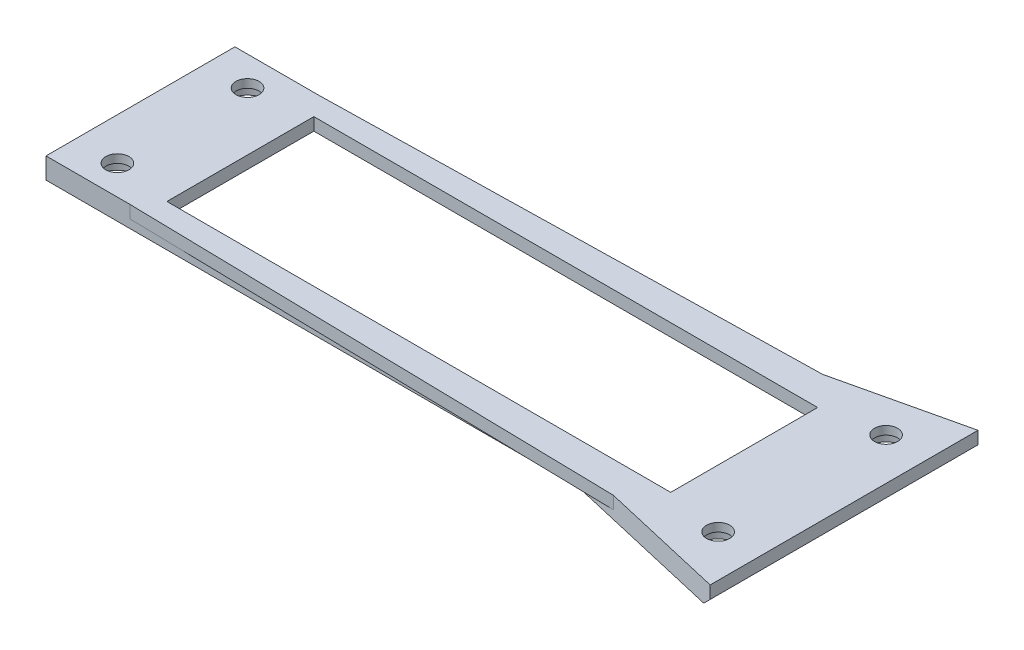
ISO-10303-21;
HEADER;
FILE_DESCRIPTION(('STEP AP214'),'2;1');
FILE_NAME('part.step','',(''),(''),'','','');
FILE_SCHEMA(('AUTOMOTIVE_DESIGN { 1 0 10303 214 1 1 1 1 }'));
ENDSEC;
DATA;
#1=APPLICATION_CONTEXT('core data for automotive mechanical design processes');
#2=APPLICATION_PROTOCOL_DEFINITION('international standard','automotive_design',2000,#1);
#3=PRODUCT_CONTEXT('',#1,'mechanical');
#4=PRODUCT('Part','Part','',(#3));
#5=PRODUCT_RELATED_PRODUCT_CATEGORY('part','',(#4));
#6=PRODUCT_DEFINITION_FORMATION('','',#4);
#7=PRODUCT_DEFINITION_CONTEXT('part definition',#1,'design');
#8=PRODUCT_DEFINITION('design','',#6,#7);
#9=PRODUCT_DEFINITION_SHAPE('','',#8);
#10=(LENGTH_UNIT() NAMED_UNIT(*) SI_UNIT(.MILLI.,.METRE.));
#11=(NAMED_UNIT(*) PLANE_ANGLE_UNIT() SI_UNIT($,.RADIAN.));
#12=(NAMED_UNIT(*) SI_UNIT($,.STERADIAN.) SOLID_ANGLE_UNIT());
#13=UNCERTAINTY_MEASURE_WITH_UNIT(LENGTH_MEASURE(1.E-05),#10,'distance_accuracy_value','');
#14=(GEOMETRIC_REPRESENTATION_CONTEXT(3) GLOBAL_UNCERTAINTY_ASSIGNED_CONTEXT((#13)) GLOBAL_UNIT_ASSIGNED_CONTEXT((#10,
#11,#12)) REPRESENTATION_CONTEXT('',''));
#15=CARTESIAN_POINT('',(0.,0.,0.));
#16=DIRECTION('',(0.,0.,1.));
#17=DIRECTION('',(1.,0.,0.));
#18=AXIS2_PLACEMENT_3D('',#15,#16,#17);
#19=CARTESIAN_POINT('',(83.8,5.,35.6771224045943));
#20=DIRECTION('',(-1.,0.,0.));
#21=DIRECTION('',(0.,0.,1.));
#22=AXIS2_PLACEMENT_3D('',#19,#20,#21);
#23=PLANE('',#22);
#24=DIRECTION('',(0.,-1.,0.));
#25=VECTOR('',#24,1.);
#26=CARTESIAN_POINT('',(83.8,5.,31.8961102765045));
#27=LINE('',#26,#25);
#28=CARTESIAN_POINT('',(83.8,5.,31.8961102765045));
#29=VERTEX_POINT('',#28);
#30=CARTESIAN_POINT('',(83.8,2.,31.8961102765045));
#31=VERTEX_POINT('',#30);
#32=EDGE_CURVE('E224',#29,#31,#27,.T.);
#33=ORIENTED_EDGE('',*,*,#32,.T.);
#34=DIRECTION('',(0.,0.,-1.));
#35=VECTOR('',#34,1.);
#36=CARTESIAN_POINT('',(83.8,2.,35.6771224045943));
#37=LINE('',#36,#35);
#38=CARTESIAN_POINT('',(83.8,2.,-31.8961102765217));
#39=VERTEX_POINT('',#38);
#40=EDGE_CURVE('E258',#31,#39,#37,.T.);
#41=ORIENTED_EDGE('',*,*,#40,.T.);
#42=DIRECTION('',(0.,1.,0.));
#43=VECTOR('',#42,1.);
#44=CARTESIAN_POINT('',(83.8,5.,-31.8961102765217));
#45=LINE('',#44,#43);
#46=CARTESIAN_POINT('',(83.8,5.,-31.8961102765217));
#47=VERTEX_POINT('',#46);
#48=EDGE_CURVE('E219',#39,#47,#45,.T.);
#49=ORIENTED_EDGE('',*,*,#48,.T.);
#50=DIRECTION('',(0.,0.,-1.));
#51=VECTOR('',#50,1.);
#52=CARTESIAN_POINT('',(83.8,5.,35.6771224045943));
#53=LINE('',#52,#51);
#54=EDGE_CURVE('E246',#29,#47,#53,.T.);
#55=ORIENTED_EDGE('',*,*,#54,.F.);
#56=EDGE_LOOP('',(#33,#41,#49,#55));
#57=FACE_BOUND('',#56,.T.);
#58=ADVANCED_FACE('F37',(#57),#23,.F.);
#59=CARTESIAN_POINT('',(-83.8,5.,-35.6771224045943));
#60=DIRECTION('',(1.,0.,0.));
#61=DIRECTION('',(0.,0.,-1.));
#62=AXIS2_PLACEMENT_3D('',#59,#60,#61);
#63=PLANE('',#62);
#64=DIRECTION('',(0.,0.,1.));
#65=VECTOR('',#64,1.);
#66=CARTESIAN_POINT('',(-83.8,0.,-35.6771224045943));
#67=LINE('',#66,#65);
#68=CARTESIAN_POINT('',(-83.8,0.,-22.5));
#69=VERTEX_POINT('',#68);
#70=CARTESIAN_POINT('',(-83.8,0.,22.5));
#71=VERTEX_POINT('',#70);
#72=EDGE_CURVE('E245',#69,#71,#67,.T.);
#73=ORIENTED_EDGE('',*,*,#72,.T.);
#74=DIRECTION('',(0.,1.,0.));
#75=VECTOR('',#74,1.);
#76=CARTESIAN_POINT('',(-83.8,5.,22.5));
#77=LINE('',#76,#75);
#78=CARTESIAN_POINT('',(-83.8,5.,22.5));
#79=VERTEX_POINT('',#78);
#80=EDGE_CURVE('E230',#71,#79,#77,.T.);
#81=ORIENTED_EDGE('',*,*,#80,.T.);
#82=DIRECTION('',(0.,0.,1.));
#83=VECTOR('',#82,1.);
#84=CARTESIAN_POINT('',(-83.8,5.,-35.6771224045943));
#85=LINE('',#84,#83);
#86=CARTESIAN_POINT('',(-83.8,5.,-22.5));
#87=VERTEX_POINT('',#86);
#88=EDGE_CURVE('E249',#87,#79,#85,.T.);
#89=ORIENTED_EDGE('',*,*,#88,.F.);
#90=DIRECTION('',(0.,-1.,0.));
#91=VECTOR('',#90,1.);
#92=CARTESIAN_POINT('',(-83.8,5.,-22.5));
#93=LINE('',#92,#91);
#94=EDGE_CURVE('E212',#87,#69,#93,.T.);
#95=ORIENTED_EDGE('',*,*,#94,.T.);
#96=EDGE_LOOP('',(#73,#81,#89,#95));
#97=FACE_BOUND('',#96,.T.);
#98=ADVANCED_FACE('F344',(#97),#63,.F.);
#99=CARTESIAN_POINT('',(0.,5.,0.));
#100=DIRECTION('',(0.,1.,0.));
#101=DIRECTION('',(0.,0.,1.));
#102=AXIS2_PLACEMENT_3D('',#99,#100,#101);
#103=PLANE('',#102);
#104=DIRECTION('',(0.,0.,-1.));
#105=VECTOR('',#104,1.);
#106=CARTESIAN_POINT('',(-60.,5.,17.5));
#107=LINE('',#106,#105);
#108=CARTESIAN_POINT('',(-60.,5.,17.5));
#109=VERTEX_POINT('',#108);
#110=CARTESIAN_POINT('',(-60.,5.,-17.5));
#111=VERTEX_POINT('',#110);
#112=EDGE_CURVE('E160',#109,#111,#107,.T.);
#113=ORIENTED_EDGE('',*,*,#112,.T.);
#114=DIRECTION('',(1.,0.,0.));
#115=VECTOR('',#114,1.);
#116=CARTESIAN_POINT('',(60.,5.,-17.5));
#117=LINE('',#116,#115);
#118=CARTESIAN_POINT('',(60.,5.,-17.5));
#119=VERTEX_POINT('',#118);
#120=EDGE_CURVE('E169',#111,#119,#117,.T.);
#121=ORIENTED_EDGE('',*,*,#120,.T.);
#122=DIRECTION('',(0.,0.,1.));
#123=VECTOR('',#122,1.);
#124=CARTESIAN_POINT('',(60.,5.,17.5));
#125=LINE('',#124,#123);
#126=CARTESIAN_POINT('',(60.,5.,17.5));
#127=VERTEX_POINT('',#126);
#128=EDGE_CURVE('E174',#119,#127,#125,.T.);
#129=ORIENTED_EDGE('',*,*,#128,.T.);
#130=DIRECTION('',(-1.,0.,0.));
#131=VECTOR('',#130,1.);
#132=CARTESIAN_POINT('',(60.,5.,17.5));
#133=LINE('',#132,#131);
#134=EDGE_CURVE('E165',#127,#109,#133,.T.);
#135=ORIENTED_EDGE('',*,*,#134,.T.);
#136=EDGE_LOOP('',(#113,#121,#129,#135));
#137=FACE_BOUND('',#136,.T.);
#138=DIRECTION('',(-1.,0.,0.));
#139=VECTOR('',#138,1.);
#140=CARTESIAN_POINT('',(0.,5.,22.5));
#141=LINE('',#140,#139);
#142=CARTESIAN_POINT('',(-63.8,5.,22.5));
#143=VERTEX_POINT('',#142);
#144=EDGE_CURVE('E228',#143,#79,#141,.T.);
#145=ORIENTED_EDGE('',*,*,#144,.F.);
#146=DIRECTION('',(-0.999786369275237,0.,-0.0206691995839033));
#147=VECTOR('',#146,1.);
#148=CARTESIAN_POINT('',(-63.8,5.,22.5));
#149=LINE('',#148,#147);
#150=CARTESIAN_POINT('',(53.7543735346199,5.,24.9302739897416));
#151=VERTEX_POINT('',#150);
#152=EDGE_CURVE('E227',#151,#143,#149,.T.);
#153=ORIENTED_EDGE('',*,*,#152,.F.);
#154=DIRECTION('',(-0.974161731885424,0.,-0.225851544448982));
#155=VECTOR('',#154,1.);
#156=CARTESIAN_POINT('',(-2.74310491286037,5.,11.8317890593797));
#157=LINE('',#156,#155);
#158=EDGE_CURVE('E221',#29,#151,#157,.T.);
#159=ORIENTED_EDGE('',*,*,#158,.F.);
#160=ORIENTED_EDGE('',*,*,#54,.T.);
#161=DIRECTION('',(0.974161731885424,0.,-0.225851544448982));
#162=VECTOR('',#161,1.);
#163=CARTESIAN_POINT('',(-2.74310491286413,5.,-11.8317890593959));
#164=LINE('',#163,#162);
#165=CARTESIAN_POINT('',(53.7543735346198,5.,-24.9302739897587));
#166=VERTEX_POINT('',#165);
#167=EDGE_CURVE('E216',#166,#47,#164,.T.);
#168=ORIENTED_EDGE('',*,*,#167,.F.);
#169=DIRECTION('',(0.999786369275234,0.,-0.0206691995840487));
#170=VECTOR('',#169,1.);
#171=CARTESIAN_POINT('',(53.7543735346197,5.,-24.9302739897587));
#172=LINE('',#171,#170);
#173=CARTESIAN_POINT('',(-63.7999999999988,5.,-22.5));
#174=VERTEX_POINT('',#173);
#175=EDGE_CURVE('E215',#174,#166,#172,.T.);
#176=ORIENTED_EDGE('',*,*,#175,.F.);
#177=DIRECTION('',(1.,0.,0.));
#178=VECTOR('',#177,1.);
#179=CARTESIAN_POINT('',(0.,5.,-22.5));
#180=LINE('',#179,#178);
#181=EDGE_CURVE('E203',#87,#174,#180,.T.);
#182=ORIENTED_EDGE('',*,*,#181,.F.);
#183=ORIENTED_EDGE('',*,*,#88,.T.);
#184=EDGE_LOOP('',(#145,#153,#159,#160,#168,#176,#182,#183));
#185=FACE_BOUND('',#184,.T.);
#186=CARTESIAN_POINT('',(-73.8,5.,-15.5));
#187=DIRECTION('',(0.,1.,0.));
#188=DIRECTION('',(0.,0.,1.));
#189=AXIS2_PLACEMENT_3D('',#186,#187,#188);
#190=CIRCLE('',#189,2.75000000000001);
#191=CARTESIAN_POINT('',(-73.8,5.,-12.75));
#192=VERTEX_POINT('',#191);
#193=EDGE_CURVE('E242',#192,#192,#190,.T.);
#194=ORIENTED_EDGE('',*,*,#193,.F.);
#195=EDGE_LOOP('',(#194));
#196=FACE_BOUND('',#195,.T.);
#197=CARTESIAN_POINT('',(73.7972396722643,5.,19.9999999999915));
#198=DIRECTION('',(0.,1.,0.));
#199=DIRECTION('',(0.,0.,1.));
#200=AXIS2_PLACEMENT_3D('',#197,#198,#199);
#201=CIRCLE('',#200,2.74999999999751);
#202=CARTESIAN_POINT('',(73.7972396722643,5.,22.749999999989));
#203=VERTEX_POINT('',#202);
#204=EDGE_CURVE('E239',#203,#203,#201,.T.);
#205=ORIENTED_EDGE('',*,*,#204,.F.);
#206=EDGE_LOOP('',(#205));
#207=FACE_BOUND('',#206,.T.);
#208=CARTESIAN_POINT('',(73.7972396722643,5.,-20.0000000000086));
#209=DIRECTION('',(0.,1.,0.));
#210=DIRECTION('',(0.,0.,1.));
#211=AXIS2_PLACEMENT_3D('',#208,#209,#210);
#212=CIRCLE('',#211,2.74999999999751);
#213=CARTESIAN_POINT('',(73.7972396722643,5.,-17.250000000011));
#214=VERTEX_POINT('',#213);
#215=EDGE_CURVE('E236',#214,#214,#212,.T.);
#216=ORIENTED_EDGE('',*,*,#215,.F.);
#217=EDGE_LOOP('',(#216));
#218=FACE_BOUND('',#217,.T.);
#219=CARTESIAN_POINT('',(-73.8,5.,15.5));
#220=DIRECTION('',(0.,1.,0.));
#221=DIRECTION('',(0.,0.,1.));
#222=AXIS2_PLACEMENT_3D('',#219,#220,#221);
#223=CIRCLE('',#222,2.75000000000001);
#224=CARTESIAN_POINT('',(-73.8,5.,18.25));
#225=VERTEX_POINT('',#224);
#226=EDGE_CURVE('E233',#225,#225,#223,.T.);
#227=ORIENTED_EDGE('',*,*,#226,.F.);
#228=EDGE_LOOP('',(#227));
#229=FACE_BOUND('',#228,.T.);
#230=ADVANCED_FACE('F176',(#137,#185,#196,#207,#218,#229),#103,.T.);
#231=CARTESIAN_POINT('',(0.,0.,0.));
#232=DIRECTION('',(0.,1.,0.));
#233=DIRECTION('',(0.,0.,1.));
#234=AXIS2_PLACEMENT_3D('',#231,#232,#233);
#235=PLANE('',#234);
#236=CARTESIAN_POINT('',(-73.8,0.,-15.5));
#237=DIRECTION('',(0.,-1.,0.));
#238=DIRECTION('',(0.,0.,-1.));
#239=AXIS2_PLACEMENT_3D('',#236,#237,#238);
#240=CIRCLE('',#239,5.);
#241=CARTESIAN_POINT('',(-73.8,0.,-20.5));
#242=VERTEX_POINT('',#241);
#243=EDGE_CURVE('E585',#242,#242,#240,.T.);
#244=ORIENTED_EDGE('',*,*,#243,.F.);
#245=EDGE_LOOP('',(#244));
#246=FACE_BOUND('',#245,.T.);
#247=CARTESIAN_POINT('',(73.7972396722643,0.,19.9999999999915));
#248=DIRECTION('',(0.,-1.,0.));
#249=DIRECTION('',(0.,0.,-1.));
#250=AXIS2_PLACEMENT_3D('',#247,#248,#249);
#251=CIRCLE('',#250,5.00000000000258);
#252=CARTESIAN_POINT('',(73.7972396722643,0.,14.9999999999889));
#253=VERTEX_POINT('',#252);
#254=EDGE_CURVE('E576',#253,#253,#251,.T.);
#255=ORIENTED_EDGE('',*,*,#254,.F.);
#256=EDGE_LOOP('',(#255));
#257=FACE_BOUND('',#256,.T.);
#258=CARTESIAN_POINT('',(73.7972396722643,0.,-20.0000000000086));
#259=DIRECTION('',(0.,-1.,0.));
#260=DIRECTION('',(0.,0.,-1.));
#261=AXIS2_PLACEMENT_3D('',#258,#259,#260);
#262=CIRCLE('',#261,5.00000000000326);
#263=CARTESIAN_POINT('',(73.7972396722643,0.,-25.0000000000118));
#264=VERTEX_POINT('',#263);
#265=EDGE_CURVE('E577',#264,#264,#262,.T.);
#266=ORIENTED_EDGE('',*,*,#265,.F.);
#267=EDGE_LOOP('',(#266));
#268=FACE_BOUND('',#267,.T.);
#269=CARTESIAN_POINT('',(-73.8,0.,15.5));
#270=DIRECTION('',(0.,-1.,0.));
#271=DIRECTION('',(0.,0.,-1.));
#272=AXIS2_PLACEMENT_3D('',#269,#270,#271);
#273=CIRCLE('',#272,5.);
#274=CARTESIAN_POINT('',(-73.8,0.,10.5));
#275=VERTEX_POINT('',#274);
#276=EDGE_CURVE('E590',#275,#275,#273,.T.);
#277=ORIENTED_EDGE('',*,*,#276,.F.);
#278=EDGE_LOOP('',(#277));
#279=FACE_BOUND('',#278,.T.);
#280=DIRECTION('',(1.,0.,0.));
#281=VECTOR('',#280,1.);
#282=CARTESIAN_POINT('',(0.,0.,19.5));
#283=LINE('',#282,#281);
#284=CARTESIAN_POINT('',(-62.,0.,19.5));
#285=VERTEX_POINT('',#284);
#286=CARTESIAN_POINT('',(62.,0.,19.5));
#287=VERTEX_POINT('',#286);
#288=EDGE_CURVE('E295',#285,#287,#283,.T.);
#289=ORIENTED_EDGE('',*,*,#288,.T.);
#290=DIRECTION('',(0.,0.,-1.));
#291=VECTOR('',#290,1.);
#292=CARTESIAN_POINT('',(62.,0.,0.));
#293=LINE('',#292,#291);
#294=CARTESIAN_POINT('',(62.,0.,-19.5));
#295=VERTEX_POINT('',#294);
#296=EDGE_CURVE('E297',#287,#295,#293,.T.);
#297=ORIENTED_EDGE('',*,*,#296,.T.);
#298=DIRECTION('',(-1.,0.,0.));
#299=VECTOR('',#298,1.);
#300=CARTESIAN_POINT('',(0.,0.,-19.5));
#301=LINE('',#300,#299);
#302=CARTESIAN_POINT('',(-62.,0.,-19.5));
#303=VERTEX_POINT('',#302);
#304=EDGE_CURVE('E291',#295,#303,#301,.T.);
#305=ORIENTED_EDGE('',*,*,#304,.T.);
#306=DIRECTION('',(0.,0.,1.));
#307=VECTOR('',#306,1.);
#308=CARTESIAN_POINT('',(-62.,0.,0.));
#309=LINE('',#308,#307);
#310=EDGE_CURVE('E293',#303,#285,#309,.T.);
#311=ORIENTED_EDGE('',*,*,#310,.T.);
#312=EDGE_LOOP('',(#289,#297,#305,#311));
#313=FACE_BOUND('',#312,.T.);
#314=DIRECTION('',(0.974161731885424,0.,-0.225851544448982));
#315=VECTOR('',#314,1.);
#316=CARTESIAN_POINT('',(90.0899470984589,0.,-33.3543838056408));
#317=LINE('',#316,#315);
#318=CARTESIAN_POINT('',(44.2812322560665,0.,-22.7340025509251));
#319=VERTEX_POINT('',#318);
#320=CARTESIAN_POINT('',(81.7999999999999,0.,-31.4324263992832));
#321=VERTEX_POINT('',#320);
#322=EDGE_CURVE('E192',#319,#321,#317,.T.);
#323=ORIENTED_EDGE('',*,*,#322,.T.);
#324=DIRECTION('',(0.,0.,1.));
#325=VECTOR('',#324,1.);
#326=CARTESIAN_POINT('',(81.7999999999999,0.,0.));
#327=LINE('',#326,#325);
#328=CARTESIAN_POINT('',(81.7999999999999,0.,31.4324263992661));
#329=VERTEX_POINT('',#328);
#330=EDGE_CURVE('E273',#321,#329,#327,.T.);
#331=ORIENTED_EDGE('',*,*,#330,.T.);
#332=DIRECTION('',(-0.974161731885424,0.,-0.225851544448982));
#333=VECTOR('',#332,1.);
#334=CARTESIAN_POINT('',(-2.74310491286037,0.,11.8317890593797));
#335=LINE('',#334,#333);
#336=CARTESIAN_POINT('',(44.2812322560733,0.,22.7340025509095));
#337=VERTEX_POINT('',#336);
#338=EDGE_CURVE('E256',#329,#337,#335,.T.);
#339=ORIENTED_EDGE('',*,*,#338,.T.);
#340=DIRECTION('',(-0.999786369275237,0.,-0.0206691995839033));
#341=VECTOR('',#340,1.);
#342=CARTESIAN_POINT('',(-0.450875609777874,0.,21.8092281253908));
#343=LINE('',#342,#341);
#344=CARTESIAN_POINT('',(32.9623343072058,0.,22.5));
#345=VERTEX_POINT('',#344);
#346=EDGE_CURVE('E267',#337,#345,#343,.T.);
#347=ORIENTED_EDGE('',*,*,#346,.T.);
#348=DIRECTION('',(-1.,0.,0.));
#349=VECTOR('',#348,1.);
#350=CARTESIAN_POINT('',(-93.8088949245351,0.,22.5));
#351=LINE('',#350,#349);
#352=EDGE_CURVE('E196',#345,#71,#351,.T.);
#353=ORIENTED_EDGE('',*,*,#352,.T.);
#354=ORIENTED_EDGE('',*,*,#72,.F.);
#355=DIRECTION('',(1.,0.,0.));
#356=VECTOR('',#355,1.);
#357=CARTESIAN_POINT('',(0.,0.,-22.5));
#358=LINE('',#357,#356);
#359=CARTESIAN_POINT('',(32.9623343065265,0.,-22.5));
#360=VERTEX_POINT('',#359);
#361=EDGE_CURVE('E252',#69,#360,#358,.T.);
#362=ORIENTED_EDGE('',*,*,#361,.T.);
#363=DIRECTION('',(0.999786369275234,0.,-0.0206691995840487));
#364=VECTOR('',#363,1.);
#365=CARTESIAN_POINT('',(-0.450875609781235,0.,-21.8092281253999));
#366=LINE('',#365,#364);
#367=EDGE_CURVE('E270',#360,#319,#366,.T.);
#368=ORIENTED_EDGE('',*,*,#367,.T.);
#369=EDGE_LOOP('',(#323,#331,#339,#347,#353,#354,#362,#368));
#370=FACE_BOUND('',#369,.T.);
#371=ADVANCED_FACE('F412',(#246,#257,#268,#279,#313,#370),#235,.F.);
#372=CARTESIAN_POINT('',(-73.8,0.,15.5));
#373=DIRECTION('',(0.,1.,0.));
#374=DIRECTION('',(0.,0.,1.));
#375=AXIS2_PLACEMENT_3D('',#372,#373,#374);
#376=CYLINDRICAL_SURFACE('',#375,2.75000000000001);
#377=CARTESIAN_POINT('',(-73.8,3.,15.5));
#378=DIRECTION('',(0.,1.,0.));
#379=DIRECTION('',(0.,0.,1.));
#380=AXIS2_PLACEMENT_3D('',#377,#378,#379);
#381=CIRCLE('',#380,2.75000000000001);
#382=CARTESIAN_POINT('',(-73.8,3.,18.25));
#383=VERTEX_POINT('',#382);
#384=EDGE_CURVE('E42',#383,#383,#381,.F.);
#385=ORIENTED_EDGE('',*,*,#384,.T.);
#386=EDGE_LOOP('',(#385));
#387=FACE_BOUND('',#386,.T.);
#388=ORIENTED_EDGE('',*,*,#226,.T.);
#389=EDGE_LOOP('',(#388));
#390=FACE_BOUND('',#389,.T.);
#391=ADVANCED_FACE('F323',(#387,#390),#376,.F.);
#392=CARTESIAN_POINT('',(73.7972396722643,0.,-20.0000000000086));
#393=DIRECTION('',(0.,1.,0.));
#394=DIRECTION('',(0.,0.,1.));
#395=AXIS2_PLACEMENT_3D('',#392,#393,#394);
#396=CYLINDRICAL_SURFACE('',#395,2.74999999999751);
#397=CARTESIAN_POINT('',(73.7972396722643,3.,-20.0000000000086));
#398=DIRECTION('',(0.,1.,0.));
#399=DIRECTION('',(0.,0.,1.));
#400=AXIS2_PLACEMENT_3D('',#397,#398,#399);
#401=CIRCLE('',#400,2.74999999999751);
#402=CARTESIAN_POINT('',(73.7972396722643,3.,-17.250000000011));
#403=VERTEX_POINT('',#402);
#404=EDGE_CURVE('E316',#403,#403,#401,.F.);
#405=ORIENTED_EDGE('',*,*,#404,.T.);
#406=EDGE_LOOP('',(#405));
#407=FACE_BOUND('',#406,.T.);
#408=ORIENTED_EDGE('',*,*,#215,.T.);
#409=EDGE_LOOP('',(#408));
#410=FACE_BOUND('',#409,.T.);
#411=ADVANCED_FACE('F465',(#407,#410),#396,.F.);
#412=CARTESIAN_POINT('',(73.7972396722643,0.,19.9999999999915));
#413=DIRECTION('',(0.,1.,0.));
#414=DIRECTION('',(0.,0.,1.));
#415=AXIS2_PLACEMENT_3D('',#412,#413,#414);
#416=CYLINDRICAL_SURFACE('',#415,2.74999999999751);
#417=CARTESIAN_POINT('',(73.7972396722643,3.,19.9999999999915));
#418=DIRECTION('',(0.,1.,0.));
#419=DIRECTION('',(0.,0.,1.));
#420=AXIS2_PLACEMENT_3D('',#417,#418,#419);
#421=CIRCLE('',#420,2.74999999999751);
#422=CARTESIAN_POINT('',(73.7972396722643,3.,22.749999999989));
#423=VERTEX_POINT('',#422);
#424=EDGE_CURVE('E314',#423,#423,#421,.F.);
#425=ORIENTED_EDGE('',*,*,#424,.T.);
#426=EDGE_LOOP('',(#425));
#427=FACE_BOUND('',#426,.T.);
#428=ORIENTED_EDGE('',*,*,#204,.T.);
#429=EDGE_LOOP('',(#428));
#430=FACE_BOUND('',#429,.T.);
#431=ADVANCED_FACE('F460',(#427,#430),#416,.F.);
#432=CARTESIAN_POINT('',(-73.8,0.,-15.5));
#433=DIRECTION('',(0.,1.,0.));
#434=DIRECTION('',(0.,0.,1.));
#435=AXIS2_PLACEMENT_3D('',#432,#433,#434);
#436=CYLINDRICAL_SURFACE('',#435,2.75000000000001);
#437=CARTESIAN_POINT('',(-73.8,3.,-15.5));
#438=DIRECTION('',(0.,1.,0.));
#439=DIRECTION('',(0.,0.,1.));
#440=AXIS2_PLACEMENT_3D('',#437,#438,#439);
#441=CIRCLE('',#440,2.75000000000001);
#442=CARTESIAN_POINT('',(-73.8,3.,-12.75));
#443=VERTEX_POINT('',#442);
#444=EDGE_CURVE('E311',#443,#443,#441,.F.);
#445=ORIENTED_EDGE('',*,*,#444,.T.);
#446=EDGE_LOOP('',(#445));
#447=FACE_BOUND('',#446,.T.);
#448=ORIENTED_EDGE('',*,*,#193,.T.);
#449=EDGE_LOOP('',(#448));
#450=FACE_BOUND('',#449,.T.);
#451=ADVANCED_FACE('F453',(#447,#450),#436,.F.);
#452=CARTESIAN_POINT('',(90.0899470984589,0.,-33.3543838056408));
#453=DIRECTION('',(0.225851544448982,0.,0.974161731885424));
#454=DIRECTION('',(0.974161731885424,0.,-0.225851544448982));
#455=AXIS2_PLACEMENT_3D('',#452,#453,#454);
#456=PLANE('',#455);
#457=ORIENTED_EDGE('',*,*,#48,.F.);
#458=DIRECTION('',(0.697792246367054,0.697792246367042,-0.161777507151205));
#459=VECTOR('',#458,1.);
#460=CARTESIAN_POINT('',(76.1718543921743,-5.62814560782554,-30.1275862107336));
#461=LINE('',#460,#459);
#462=EDGE_CURVE('E265',#39,#321,#461,.F.);
#463=ORIENTED_EDGE('',*,*,#462,.T.);
#464=ORIENTED_EDGE('',*,*,#322,.F.);
#465=DIRECTION('',(-0.954189918177286,-0.201451638927323,0.221221240441146));
#466=VECTOR('',#465,1.);
#467=CARTESIAN_POINT('',(88.2309028886231,9.27879556321149,-32.9233793920536));
#468=LINE('',#467,#466);
#469=CARTESIAN_POINT('',(53.7543735346197,2.00000000000003,-24.9302739897587));
#470=VERTEX_POINT('',#469);
#471=EDGE_CURVE('E281',#319,#470,#468,.F.);
#472=ORIENTED_EDGE('',*,*,#471,.T.);
#473=DIRECTION('',(0.,1.,0.));
#474=VECTOR('',#473,1.);
#475=CARTESIAN_POINT('',(53.7543735346197,0.,-24.9302739897587));
#476=LINE('',#475,#474);
#477=EDGE_CURVE('E200',#470,#166,#476,.T.);
#478=ORIENTED_EDGE('',*,*,#477,.T.);
#479=ORIENTED_EDGE('',*,*,#167,.T.);
#480=EDGE_LOOP('',(#457,#463,#464,#472,#478,#479));
#481=FACE_BOUND('',#480,.T.);
#482=ADVANCED_FACE('F451',(#481),#456,.F.);
#483=CARTESIAN_POINT('',(-63.8,0.,-22.5));
#484=DIRECTION('',(0.,0.,1.));
#485=DIRECTION('',(1.,0.,0.));
#486=AXIS2_PLACEMENT_3D('',#483,#484,#485);
#487=PLANE('',#486);
#488=ORIENTED_EDGE('',*,*,#181,.T.);
#489=DIRECTION('',(0.,1.,0.));
#490=VECTOR('',#489,1.);
#491=CARTESIAN_POINT('',(-63.8,0.,-22.5));
#492=LINE('',#491,#490);
#493=CARTESIAN_POINT('',(-63.8,2.00000000000003,-22.5));
#494=VERTEX_POINT('',#493);
#495=EDGE_CURVE('E207',#494,#174,#492,.T.);
#496=ORIENTED_EDGE('',*,*,#495,.F.);
#497=DIRECTION('',(-0.999786460512426,0.0206647858937609,0.));
#498=VECTOR('',#497,1.);
#499=CARTESIAN_POINT('',(-63.7586792537081,1.99914593324796,-22.5));
#500=LINE('',#499,#498);
#501=EDGE_CURVE('E283',#494,#360,#500,.F.);
#502=ORIENTED_EDGE('',*,*,#501,.T.);
#503=ORIENTED_EDGE('',*,*,#361,.F.);
#504=ORIENTED_EDGE('',*,*,#94,.F.);
#505=EDGE_LOOP('',(#488,#496,#502,#503,#504));
#506=FACE_BOUND('',#505,.T.);
#507=ADVANCED_FACE('F444',(#506),#487,.F.);
#508=CARTESIAN_POINT('',(53.7543735346197,0.,-24.9302739897587));
#509=DIRECTION('',(0.0206691995840487,0.,0.999786369275234));
#510=DIRECTION('',(0.999786369275234,0.,-0.0206691995840487));
#511=AXIS2_PLACEMENT_3D('',#508,#509,#510);
#512=PLANE('',#511);
#513=ORIENTED_EDGE('',*,*,#477,.F.);
#514=DIRECTION('',(-0.999786369275234,0.,0.0206691995840487));
#515=VECTOR('',#514,1.);
#516=CARTESIAN_POINT('',(53.7543735346197,2.00000000000003,-24.9302739897587));
#517=LINE('',#516,#515);
#518=EDGE_CURVE('E277',#470,#494,#517,.T.);
#519=ORIENTED_EDGE('',*,*,#518,.T.);
#520=ORIENTED_EDGE('',*,*,#495,.T.);
#521=ORIENTED_EDGE('',*,*,#175,.T.);
#522=EDGE_LOOP('',(#513,#519,#520,#521));
#523=FACE_BOUND('',#522,.T.);
#524=ADVANCED_FACE('F448',(#523),#512,.F.);
#525=CARTESIAN_POINT('',(-93.8088949245351,0.,22.5));
#526=DIRECTION('',(0.,0.,-1.));
#527=DIRECTION('',(-1.,0.,0.));
#528=AXIS2_PLACEMENT_3D('',#525,#526,#527);
#529=PLANE('',#528);
#530=ORIENTED_EDGE('',*,*,#352,.F.);
#531=DIRECTION('',(0.999786460512429,-0.0206647858936156,0.));
#532=VECTOR('',#531,1.);
#533=CARTESIAN_POINT('',(-93.7547593785329,2.61914090008269,22.5));
#534=LINE('',#533,#532);
#535=CARTESIAN_POINT('',(-63.8,2.,22.5));
#536=VERTEX_POINT('',#535);
#537=EDGE_CURVE('E286',#345,#536,#534,.F.);
#538=ORIENTED_EDGE('',*,*,#537,.T.);
#539=DIRECTION('',(0.,1.,0.));
#540=VECTOR('',#539,1.);
#541=CARTESIAN_POINT('',(-63.8,0.,22.5));
#542=LINE('',#541,#540);
#543=EDGE_CURVE('E201',#536,#143,#542,.T.);
#544=ORIENTED_EDGE('',*,*,#543,.T.);
#545=ORIENTED_EDGE('',*,*,#144,.T.);
#546=ORIENTED_EDGE('',*,*,#80,.F.);
#547=EDGE_LOOP('',(#530,#538,#544,#545,#546));
#548=FACE_BOUND('',#547,.T.);
#549=ADVANCED_FACE('F691',(#548),#529,.F.);
#550=CARTESIAN_POINT('',(53.7543735346197,0.,24.9302739897416));
#551=DIRECTION('',(0.225851544448982,0.,-0.974161731885424));
#552=DIRECTION('',(-0.974161731885424,0.,-0.225851544448982));
#553=AXIS2_PLACEMENT_3D('',#550,#551,#552);
#554=PLANE('',#553);
#555=ORIENTED_EDGE('',*,*,#338,.F.);
#556=DIRECTION('',(-0.697792246367054,-0.697792246367042,-0.161777507151204));
#557=VECTOR('',#556,1.);
#558=CARTESIAN_POINT('',(84.2268274568738,2.42682745687381,31.9950667815621));
#559=LINE('',#558,#557);
#560=EDGE_CURVE('E275',#329,#31,#559,.F.);
#561=ORIENTED_EDGE('',*,*,#560,.T.);
#562=ORIENTED_EDGE('',*,*,#32,.F.);
#563=ORIENTED_EDGE('',*,*,#158,.T.);
#564=DIRECTION('',(0.,1.,0.));
#565=VECTOR('',#564,1.);
#566=CARTESIAN_POINT('',(53.7543735346197,0.,24.9302739897416));
#567=LINE('',#566,#565);
#568=CARTESIAN_POINT('',(53.7543735346197,2.,24.9302739897416));
#569=VERTEX_POINT('',#568);
#570=EDGE_CURVE('E199',#569,#151,#567,.T.);
#571=ORIENTED_EDGE('',*,*,#570,.F.);
#572=DIRECTION('',(0.95418991817726,0.201451638927457,0.221221240441139));
#573=VECTOR('',#572,1.);
#574=CARTESIAN_POINT('',(53.3699272888899,1.91883447434689,24.8411432268367));
#575=LINE('',#574,#573);
#576=EDGE_CURVE('E288',#569,#337,#575,.F.);
#577=ORIENTED_EDGE('',*,*,#576,.T.);
#578=EDGE_LOOP('',(#555,#561,#562,#563,#571,#577));
#579=FACE_BOUND('',#578,.T.);
#580=ADVANCED_FACE('F424',(#579),#554,.F.);
#581=CARTESIAN_POINT('',(-63.8,0.,22.5));
#582=DIRECTION('',(0.0206691995839033,0.,-0.999786369275237));
#583=DIRECTION('',(-0.999786369275237,0.,-0.0206691995839033));
#584=AXIS2_PLACEMENT_3D('',#581,#582,#583);
#585=PLANE('',#584);
#586=ORIENTED_EDGE('',*,*,#543,.F.);
#587=DIRECTION('',(0.999786369275237,0.,0.0206691995839033));
#588=VECTOR('',#587,1.);
#589=CARTESIAN_POINT('',(-63.8,2.,22.5));
#590=LINE('',#589,#588);
#591=EDGE_CURVE('E279',#536,#569,#590,.T.);
#592=ORIENTED_EDGE('',*,*,#591,.T.);
#593=ORIENTED_EDGE('',*,*,#570,.T.);
#594=ORIENTED_EDGE('',*,*,#152,.T.);
#595=EDGE_LOOP('',(#586,#592,#593,#594));
#596=FACE_BOUND('',#595,.T.);
#597=ADVANCED_FACE('F362',(#596),#585,.F.);
#598=CARTESIAN_POINT('',(83.8,2.,35.6771224045943));
#599=DIRECTION('',(-0.707106781186541,0.707106781186554,0.));
#600=DIRECTION('',(0.,0.,-1.));
#601=AXIS2_PLACEMENT_3D('',#598,#599,#600);
#602=PLANE('',#601);
#603=ORIENTED_EDGE('',*,*,#560,.F.);
#604=ORIENTED_EDGE('',*,*,#330,.F.);
#605=ORIENTED_EDGE('',*,*,#462,.F.);
#606=ORIENTED_EDGE('',*,*,#40,.F.);
#607=EDGE_LOOP('',(#603,#604,#605,#606));
#608=FACE_BOUND('',#607,.T.);
#609=ADVANCED_FACE('F355',(#608),#602,.F.);
#610=CARTESIAN_POINT('',(-0.450875609781235,0.,-21.8092281253999));
#611=DIRECTION('',(0.014615331187579,0.707106781186549,0.706955721452395));
#612=DIRECTION('',(0.999786369275234,0.,-0.0206691995840487));
#613=AXIS2_PLACEMENT_3D('',#610,#611,#612);
#614=PLANE('',#613);
#615=ORIENTED_EDGE('',*,*,#501,.F.);
#616=ORIENTED_EDGE('',*,*,#518,.F.);
#617=ORIENTED_EDGE('',*,*,#471,.F.);
#618=ORIENTED_EDGE('',*,*,#367,.F.);
#619=EDGE_LOOP('',(#615,#616,#617,#618));
#620=FACE_BOUND('',#619,.T.);
#621=ADVANCED_FACE('F361',(#620),#614,.F.);
#622=CARTESIAN_POINT('',(-0.450875609777874,0.,21.8092281253908));
#623=DIRECTION('',(0.0146153311874762,0.707106781186547,-0.706955721452398));
#624=DIRECTION('',(-0.999786369275237,0.,-0.0206691995839033));
#625=AXIS2_PLACEMENT_3D('',#622,#623,#624);
#626=PLANE('',#625);
#627=ORIENTED_EDGE('',*,*,#576,.F.);
#628=ORIENTED_EDGE('',*,*,#591,.F.);
#629=ORIENTED_EDGE('',*,*,#537,.F.);
#630=ORIENTED_EDGE('',*,*,#346,.F.);
#631=EDGE_LOOP('',(#627,#628,#629,#630));
#632=FACE_BOUND('',#631,.T.);
#633=ADVANCED_FACE('F369',(#632),#626,.F.);
#634=CARTESIAN_POINT('',(-60.,5.,17.5));
#635=DIRECTION('',(-1.,0.,0.));
#636=DIRECTION('',(0.,0.,1.));
#637=AXIS2_PLACEMENT_3D('',#634,#635,#636);
#638=PLANE('',#637);
#639=DIRECTION('',(0.,-1.,0.));
#640=VECTOR('',#639,1.);
#641=CARTESIAN_POINT('',(-60.,5.,17.5));
#642=LINE('',#641,#640);
#643=CARTESIAN_POINT('',(-60.,2.00000000000003,17.5));
#644=VERTEX_POINT('',#643);
#645=EDGE_CURVE('E190',#109,#644,#642,.T.);
#646=ORIENTED_EDGE('',*,*,#645,.T.);
#647=DIRECTION('',(0.,0.,-1.));
#648=VECTOR('',#647,1.);
#649=CARTESIAN_POINT('',(-60.,2.00000000000003,17.5));
#650=LINE('',#649,#648);
#651=CARTESIAN_POINT('',(-60.,2.00000000000003,-17.5));
#652=VERTEX_POINT('',#651);
#653=EDGE_CURVE('E47',#644,#652,#650,.T.);
#654=ORIENTED_EDGE('',*,*,#653,.T.);
#655=DIRECTION('',(0.,-1.,0.));
#656=VECTOR('',#655,1.);
#657=CARTESIAN_POINT('',(-60.,5.,-17.5));
#658=LINE('',#657,#656);
#659=EDGE_CURVE('E156',#111,#652,#658,.T.);
#660=ORIENTED_EDGE('',*,*,#659,.F.);
#661=ORIENTED_EDGE('',*,*,#112,.F.);
#662=EDGE_LOOP('',(#646,#654,#660,#661));
#663=FACE_BOUND('',#662,.T.);
#664=ADVANCED_FACE('F158',(#663),#638,.F.);
#665=CARTESIAN_POINT('',(60.,5.,17.5));
#666=DIRECTION('',(0.,0.,1.));
#667=DIRECTION('',(1.,0.,0.));
#668=AXIS2_PLACEMENT_3D('',#665,#666,#667);
#669=PLANE('',#668);
#670=DIRECTION('',(0.,-1.,0.));
#671=VECTOR('',#670,1.);
#672=CARTESIAN_POINT('',(60.,5.,17.5));
#673=LINE('',#672,#671);
#674=CARTESIAN_POINT('',(60.,2.00000000000003,17.5));
#675=VERTEX_POINT('',#674);
#676=EDGE_CURVE('E193',#127,#675,#673,.T.);
#677=ORIENTED_EDGE('',*,*,#676,.T.);
#678=DIRECTION('',(-1.,0.,0.));
#679=VECTOR('',#678,1.);
#680=CARTESIAN_POINT('',(60.,2.00000000000003,17.5));
#681=LINE('',#680,#679);
#682=EDGE_CURVE('E62',#675,#644,#681,.T.);
#683=ORIENTED_EDGE('',*,*,#682,.T.);
#684=ORIENTED_EDGE('',*,*,#645,.F.);
#685=ORIENTED_EDGE('',*,*,#134,.F.);
#686=EDGE_LOOP('',(#677,#683,#684,#685));
#687=FACE_BOUND('',#686,.T.);
#688=ADVANCED_FACE('F652',(#687),#669,.F.);
#689=CARTESIAN_POINT('',(60.,5.,17.5));
#690=DIRECTION('',(1.,0.,0.));
#691=DIRECTION('',(0.,0.,-1.));
#692=AXIS2_PLACEMENT_3D('',#689,#690,#691);
#693=PLANE('',#692);
#694=DIRECTION('',(0.,-1.,0.));
#695=VECTOR('',#694,1.);
#696=CARTESIAN_POINT('',(60.,5.,-17.5));
#697=LINE('',#696,#695);
#698=CARTESIAN_POINT('',(60.,2.00000000000003,-17.5));
#699=VERTEX_POINT('',#698);
#700=EDGE_CURVE('E164',#119,#699,#697,.T.);
#701=ORIENTED_EDGE('',*,*,#700,.T.);
#702=DIRECTION('',(0.,0.,1.));
#703=VECTOR('',#702,1.);
#704=CARTESIAN_POINT('',(60.,2.00000000000003,17.5));
#705=LINE('',#704,#703);
#706=EDGE_CURVE('E300',#699,#675,#705,.T.);
#707=ORIENTED_EDGE('',*,*,#706,.T.);
#708=ORIENTED_EDGE('',*,*,#676,.F.);
#709=ORIENTED_EDGE('',*,*,#128,.F.);
#710=EDGE_LOOP('',(#701,#707,#708,#709));
#711=FACE_BOUND('',#710,.T.);
#712=ADVANCED_FACE('F409',(#711),#693,.F.);
#713=CARTESIAN_POINT('',(60.,5.,-17.5));
#714=DIRECTION('',(0.,0.,-1.));
#715=DIRECTION('',(-1.,0.,0.));
#716=AXIS2_PLACEMENT_3D('',#713,#714,#715);
#717=PLANE('',#716);
#718=ORIENTED_EDGE('',*,*,#659,.T.);
#719=DIRECTION('',(1.,0.,0.));
#720=VECTOR('',#719,1.);
#721=CARTESIAN_POINT('',(60.,2.00000000000003,-17.5));
#722=LINE('',#721,#720);
#723=EDGE_CURVE('E12',#652,#699,#722,.T.);
#724=ORIENTED_EDGE('',*,*,#723,.T.);
#725=ORIENTED_EDGE('',*,*,#700,.F.);
#726=ORIENTED_EDGE('',*,*,#120,.F.);
#727=EDGE_LOOP('',(#718,#724,#725,#726));
#728=FACE_BOUND('',#727,.T.);
#729=ADVANCED_FACE('F170',(#728),#717,.F.);
#730=CARTESIAN_POINT('',(-62.,0.,0.));
#731=DIRECTION('',(-0.707106781186548,0.707106781186547,0.));
#732=DIRECTION('',(0.,0.,1.));
#733=AXIS2_PLACEMENT_3D('',#730,#731,#732);
#734=PLANE('',#733);
#735=DIRECTION('',(-0.577350269189625,-0.577350269189626,-0.577350269189627));
#736=VECTOR('',#735,1.);
#737=CARTESIAN_POINT('',(-55.5,6.50000000000002,-13.));
#738=LINE('',#737,#736);
#739=EDGE_CURVE('E182',#652,#303,#738,.T.);
#740=ORIENTED_EDGE('',*,*,#739,.F.);
#741=ORIENTED_EDGE('',*,*,#653,.F.);
#742=DIRECTION('',(-0.577350269189625,-0.577350269189626,0.577350269189626));
#743=VECTOR('',#742,1.);
#744=CARTESIAN_POINT('',(-41.3333333333334,20.6666666666667,-1.16666666666663));
#745=LINE('',#744,#743);
#746=EDGE_CURVE('E179',#285,#644,#745,.F.);
#747=ORIENTED_EDGE('',*,*,#746,.F.);
#748=ORIENTED_EDGE('',*,*,#310,.F.);
#749=EDGE_LOOP('',(#740,#741,#747,#748));
#750=FACE_BOUND('',#749,.T.);
#751=ADVANCED_FACE('F40',(#750),#734,.F.);
#752=CARTESIAN_POINT('',(0.,0.,19.5));
#753=DIRECTION('',(0.,0.707106781186547,0.707106781186547));
#754=DIRECTION('',(1.,0.,0.));
#755=AXIS2_PLACEMENT_3D('',#752,#753,#754);
#756=PLANE('',#755);
#757=ORIENTED_EDGE('',*,*,#746,.T.);
#758=ORIENTED_EDGE('',*,*,#682,.F.);
#759=DIRECTION('',(0.577350269189626,-0.577350269189626,0.577350269189626));
#760=VECTOR('',#759,1.);
#761=CARTESIAN_POINT('',(55.5,6.50000000000001,13.));
#762=LINE('',#761,#760);
#763=EDGE_CURVE('E307',#287,#675,#762,.F.);
#764=ORIENTED_EDGE('',*,*,#763,.F.);
#765=ORIENTED_EDGE('',*,*,#288,.F.);
#766=EDGE_LOOP('',(#757,#758,#764,#765));
#767=FACE_BOUND('',#766,.T.);
#768=ADVANCED_FACE('F390',(#767),#756,.F.);
#769=CARTESIAN_POINT('',(0.,0.,-19.5));
#770=DIRECTION('',(0.,0.707106781186548,-0.707106781186547));
#771=DIRECTION('',(-1.,0.,0.));
#772=AXIS2_PLACEMENT_3D('',#769,#770,#771);
#773=PLANE('',#772);
#774=ORIENTED_EDGE('',*,*,#739,.T.);
#775=ORIENTED_EDGE('',*,*,#304,.F.);
#776=DIRECTION('',(-0.577350269189626,0.577350269189626,0.577350269189626));
#777=VECTOR('',#776,1.);
#778=CARTESIAN_POINT('',(55.5,6.50000000000002,-13.));
#779=LINE('',#778,#777);
#780=EDGE_CURVE('E305',#699,#295,#779,.F.);
#781=ORIENTED_EDGE('',*,*,#780,.F.);
#782=ORIENTED_EDGE('',*,*,#723,.F.);
#783=EDGE_LOOP('',(#774,#775,#781,#782));
#784=FACE_BOUND('',#783,.T.);
#785=ADVANCED_FACE('F384',(#784),#773,.F.);
#786=CARTESIAN_POINT('',(62.,0.,0.));
#787=DIRECTION('',(0.707106781186547,0.707106781186547,0.));
#788=DIRECTION('',(0.,0.,-1.));
#789=AXIS2_PLACEMENT_3D('',#786,#787,#788);
#790=PLANE('',#789);
#791=ORIENTED_EDGE('',*,*,#763,.T.);
#792=ORIENTED_EDGE('',*,*,#706,.F.);
#793=ORIENTED_EDGE('',*,*,#780,.T.);
#794=ORIENTED_EDGE('',*,*,#296,.F.);
#795=EDGE_LOOP('',(#791,#792,#793,#794));
#796=FACE_BOUND('',#795,.T.);
#797=ADVANCED_FACE('F377',(#796),#790,.F.);
#798=CARTESIAN_POINT('',(0.,3.,0.));
#799=DIRECTION('',(0.,1.,0.));
#800=DIRECTION('',(0.,0.,1.));
#801=AXIS2_PLACEMENT_3D('',#798,#799,#800);
#802=PLANE('',#801);
#803=CARTESIAN_POINT('',(-73.8,3.,-15.5));
#804=DIRECTION('',(0.,1.,0.));
#805=DIRECTION('',(0.,0.,1.));
#806=AXIS2_PLACEMENT_3D('',#803,#804,#805);
#807=CIRCLE('',#806,5.);
#808=CARTESIAN_POINT('',(-73.8,3.,-10.5));
#809=VERTEX_POINT('',#808);
#810=EDGE_CURVE('E588',#809,#809,#807,.F.);
#811=ORIENTED_EDGE('',*,*,#810,.T.);
#812=EDGE_LOOP('',(#811));
#813=FACE_BOUND('',#812,.T.);
#814=ORIENTED_EDGE('',*,*,#444,.F.);
#815=EDGE_LOOP('',(#814));
#816=FACE_BOUND('',#815,.T.);
#817=ADVANCED_FACE('F383',(#813,#816),#802,.F.);
#818=CARTESIAN_POINT('',(-73.8,19.1421356237402,-15.5));
#819=DIRECTION('',(0.,-1.,0.));
#820=DIRECTION('',(0.,0.,-1.));
#821=AXIS2_PLACEMENT_3D('',#818,#819,#820);
#822=CYLINDRICAL_SURFACE('',#821,5.);
#823=ORIENTED_EDGE('',*,*,#243,.T.);
#824=EDGE_LOOP('',(#823));
#825=FACE_BOUND('',#824,.T.);
#826=ORIENTED_EDGE('',*,*,#810,.F.);
#827=EDGE_LOOP('',(#826));
#828=FACE_BOUND('',#827,.T.);
#829=ADVANCED_FACE('F511',(#825,#828),#822,.F.);
#830=CARTESIAN_POINT('',(0.,3.,0.));
#831=DIRECTION('',(0.,1.,0.));
#832=DIRECTION('',(0.,0.,1.));
#833=AXIS2_PLACEMENT_3D('',#830,#831,#832);
#834=PLANE('',#833);
#835=CARTESIAN_POINT('',(73.7972396722643,3.,19.9999999999915));
#836=DIRECTION('',(0.,1.,0.));
#837=DIRECTION('',(0.,0.,1.));
#838=AXIS2_PLACEMENT_3D('',#835,#836,#837);
#839=CIRCLE('',#838,5.00000000000258);
#840=CARTESIAN_POINT('',(73.7972396722643,3.,24.999999999994));
#841=VERTEX_POINT('',#840);
#842=EDGE_CURVE('E580',#841,#841,#839,.F.);
#843=ORIENTED_EDGE('',*,*,#842,.T.);
#844=EDGE_LOOP('',(#843));
#845=FACE_BOUND('',#844,.T.);
#846=ORIENTED_EDGE('',*,*,#424,.F.);
#847=EDGE_LOOP('',(#846));
#848=FACE_BOUND('',#847,.T.);
#849=ADVANCED_FACE('F522',(#845,#848),#834,.F.);
#850=CARTESIAN_POINT('',(73.7972396722643,19.1421356237402,19.9999999999915));
#851=DIRECTION('',(0.,-1.,0.));
#852=DIRECTION('',(0.,0.,-1.));
#853=AXIS2_PLACEMENT_3D('',#850,#851,#852);
#854=CYLINDRICAL_SURFACE('',#853,5.00000000000258);
#855=ORIENTED_EDGE('',*,*,#254,.T.);
#856=EDGE_LOOP('',(#855));
#857=FACE_BOUND('',#856,.T.);
#858=ORIENTED_EDGE('',*,*,#842,.F.);
#859=EDGE_LOOP('',(#858));
#860=FACE_BOUND('',#859,.T.);
#861=ADVANCED_FACE('F532',(#857,#860),#854,.F.);
#862=CARTESIAN_POINT('',(0.,3.,0.));
#863=DIRECTION('',(0.,1.,0.));
#864=DIRECTION('',(0.,0.,1.));
#865=AXIS2_PLACEMENT_3D('',#862,#863,#864);
#866=PLANE('',#865);
#867=CARTESIAN_POINT('',(73.7972396722643,3.,-20.0000000000086));
#868=DIRECTION('',(0.,1.,0.));
#869=DIRECTION('',(0.,0.,1.));
#870=AXIS2_PLACEMENT_3D('',#867,#868,#869);
#871=CIRCLE('',#870,5.00000000000326);
#872=CARTESIAN_POINT('',(73.7972396722643,3.,-15.0000000000053));
#873=VERTEX_POINT('',#872);
#874=EDGE_CURVE('E574',#873,#873,#871,.F.);
#875=ORIENTED_EDGE('',*,*,#874,.T.);
#876=EDGE_LOOP('',(#875));
#877=FACE_BOUND('',#876,.T.);
#878=ORIENTED_EDGE('',*,*,#404,.F.);
#879=EDGE_LOOP('',(#878));
#880=FACE_BOUND('',#879,.T.);
#881=ADVANCED_FACE('F338',(#877,#880),#866,.F.);
#882=CARTESIAN_POINT('',(73.7972396722643,19.1421356237402,-20.0000000000086));
#883=DIRECTION('',(0.,-1.,0.));
#884=DIRECTION('',(0.,0.,-1.));
#885=AXIS2_PLACEMENT_3D('',#882,#883,#884);
#886=CYLINDRICAL_SURFACE('',#885,5.00000000000326);
#887=ORIENTED_EDGE('',*,*,#265,.T.);
#888=EDGE_LOOP('',(#887));
#889=FACE_BOUND('',#888,.T.);
#890=ORIENTED_EDGE('',*,*,#874,.F.);
#891=EDGE_LOOP('',(#890));
#892=FACE_BOUND('',#891,.T.);
#893=ADVANCED_FACE('F329',(#889,#892),#886,.F.);
#894=CARTESIAN_POINT('',(0.,3.,0.));
#895=DIRECTION('',(0.,1.,0.));
#896=DIRECTION('',(0.,0.,1.));
#897=AXIS2_PLACEMENT_3D('',#894,#895,#896);
#898=PLANE('',#897);
#899=CARTESIAN_POINT('',(-73.8,3.,15.5));
#900=DIRECTION('',(0.,1.,0.));
#901=DIRECTION('',(0.,0.,1.));
#902=AXIS2_PLACEMENT_3D('',#899,#900,#901);
#903=CIRCLE('',#902,5.);
#904=CARTESIAN_POINT('',(-73.8,3.,20.5));
#905=VERTEX_POINT('',#904);
#906=EDGE_CURVE('E185',#905,#905,#903,.F.);
#907=ORIENTED_EDGE('',*,*,#906,.T.);
#908=EDGE_LOOP('',(#907));
#909=FACE_BOUND('',#908,.T.);
#910=ORIENTED_EDGE('',*,*,#384,.F.);
#911=EDGE_LOOP('',(#910));
#912=FACE_BOUND('',#911,.T.);
#913=ADVANCED_FACE('F326',(#909,#912),#898,.F.);
#914=CARTESIAN_POINT('',(-73.8,19.1421356237402,15.5));
#915=DIRECTION('',(0.,-1.,0.));
#916=DIRECTION('',(0.,0.,-1.));
#917=AXIS2_PLACEMENT_3D('',#914,#915,#916);
#918=CYLINDRICAL_SURFACE('',#917,5.);
#919=ORIENTED_EDGE('',*,*,#276,.T.);
#920=EDGE_LOOP('',(#919));
#921=FACE_BOUND('',#920,.T.);
#922=ORIENTED_EDGE('',*,*,#906,.F.);
#923=EDGE_LOOP('',(#922));
#924=FACE_BOUND('',#923,.T.);
#925=ADVANCED_FACE('F328',(#921,#924),#918,.F.);
#926=CLOSED_SHELL('',(#58,#98,#230,#371,#391,#411,#431,#451,#482,#507,#524,#549,#580,#597,#609,
#621,#633,#664,#688,#712,#729,#751,#768,#785,#797,#817,#829,#849,#861,#881,#893,#913,#925));
#927=MANIFOLD_SOLID_BREP('B2',#926);
#928=ADVANCED_BREP_SHAPE_REPRESENTATION('',(#18,#927),#14);
#929=SHAPE_DEFINITION_REPRESENTATION(#9,#928);
ENDSEC;
END-ISO-10303-21;
